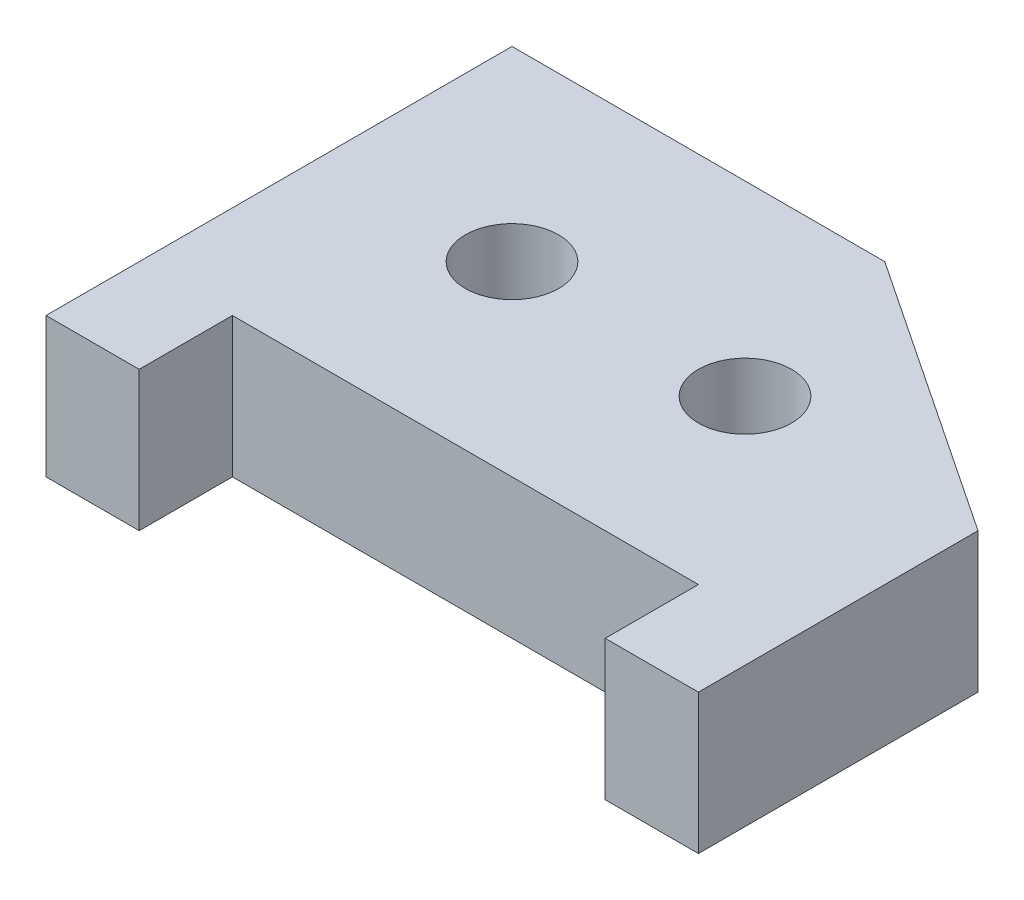
ISO-10303-21;
HEADER;
FILE_DESCRIPTION(('STEP AP214'),'2;1');
FILE_NAME('part.step','',(''),(''),'','','');
FILE_SCHEMA(('AUTOMOTIVE_DESIGN { 1 0 10303 214 1 1 1 1 }'));
ENDSEC;
DATA;
#1=APPLICATION_CONTEXT('core data for automotive mechanical design processes');
#2=APPLICATION_PROTOCOL_DEFINITION('international standard','automotive_design',2000,#1);
#3=PRODUCT_CONTEXT('',#1,'mechanical');
#4=PRODUCT('Part','Part','',(#3));
#5=PRODUCT_RELATED_PRODUCT_CATEGORY('part','',(#4));
#6=PRODUCT_DEFINITION_FORMATION('','',#4);
#7=PRODUCT_DEFINITION_CONTEXT('part definition',#1,'design');
#8=PRODUCT_DEFINITION('design','',#6,#7);
#9=PRODUCT_DEFINITION_SHAPE('','',#8);
#10=(LENGTH_UNIT() NAMED_UNIT(*) SI_UNIT(.MILLI.,.METRE.));
#11=(NAMED_UNIT(*) PLANE_ANGLE_UNIT() SI_UNIT($,.RADIAN.));
#12=(NAMED_UNIT(*) SI_UNIT($,.STERADIAN.) SOLID_ANGLE_UNIT());
#13=UNCERTAINTY_MEASURE_WITH_UNIT(LENGTH_MEASURE(1.E-05),#10,'distance_accuracy_value','');
#14=(GEOMETRIC_REPRESENTATION_CONTEXT(3) GLOBAL_UNCERTAINTY_ASSIGNED_CONTEXT((#13)) GLOBAL_UNIT_ASSIGNED_CONTEXT((#10,
#11,#12)) REPRESENTATION_CONTEXT('',''));
#15=CARTESIAN_POINT('',(0.,0.,0.));
#16=DIRECTION('',(0.,0.,1.));
#17=DIRECTION('',(1.,0.,0.));
#18=AXIS2_PLACEMENT_3D('',#15,#16,#17);
#19=CARTESIAN_POINT('',(0.,19.05,0.));
#20=DIRECTION('',(0.,1.,0.));
#21=DIRECTION('',(0.,0.,1.));
#22=AXIS2_PLACEMENT_3D('',#19,#20,#21);
#23=PLANE('',#22);
#24=CARTESIAN_POINT('',(-63.5,19.05,-38.1));
#25=DIRECTION('',(0.,1.,0.));
#26=DIRECTION('',(0.,0.,1.));
#27=AXIS2_PLACEMENT_3D('',#24,#25,#26);
#28=CIRCLE('',#27,6.35);
#29=CARTESIAN_POINT('',(-63.5,19.05,-44.45));
#30=VERTEX_POINT('',#29);
#31=EDGE_CURVE('E152',#30,#30,#28,.T.);
#32=ORIENTED_EDGE('',*,*,#31,.F.);
#33=EDGE_LOOP('',(#32));
#34=FACE_BOUND('',#33,.T.);
#35=DIRECTION('',(0.,0.,1.));
#36=VECTOR('',#35,1.);
#37=CARTESIAN_POINT('',(-88.9,19.05,-63.5));
#38=LINE('',#37,#36);
#39=CARTESIAN_POINT('',(-88.9,19.05,-63.5));
#40=VERTEX_POINT('',#39);
#41=CARTESIAN_POINT('',(-88.9,19.05,0.));
#42=VERTEX_POINT('',#41);
#43=EDGE_CURVE('E173',#40,#42,#38,.T.);
#44=ORIENTED_EDGE('',*,*,#43,.T.);
#45=DIRECTION('',(1.,0.,0.));
#46=VECTOR('',#45,1.);
#47=CARTESIAN_POINT('',(-88.9,19.05,0.));
#48=LINE('',#47,#46);
#49=CARTESIAN_POINT('',(-76.2,19.05,0.));
#50=VERTEX_POINT('',#49);
#51=EDGE_CURVE('E103',#42,#50,#48,.T.);
#52=ORIENTED_EDGE('',*,*,#51,.T.);
#53=DIRECTION('',(0.,0.,-1.));
#54=VECTOR('',#53,1.);
#55=CARTESIAN_POINT('',(-76.2,19.05,0.));
#56=LINE('',#55,#54);
#57=CARTESIAN_POINT('',(-76.2,19.05,-12.7));
#58=VERTEX_POINT('',#57);
#59=EDGE_CURVE('E198',#50,#58,#56,.T.);
#60=ORIENTED_EDGE('',*,*,#59,.T.);
#61=DIRECTION('',(1.,0.,0.));
#62=VECTOR('',#61,1.);
#63=CARTESIAN_POINT('',(-76.2,19.05,-12.7));
#64=LINE('',#63,#62);
#65=CARTESIAN_POINT('',(-12.7,19.05,-12.7));
#66=VERTEX_POINT('',#65);
#67=EDGE_CURVE('E216',#58,#66,#64,.T.);
#68=ORIENTED_EDGE('',*,*,#67,.T.);
#69=DIRECTION('',(0.,0.,1.));
#70=VECTOR('',#69,1.);
#71=CARTESIAN_POINT('',(-12.7,19.05,-12.7));
#72=LINE('',#71,#70);
#73=CARTESIAN_POINT('',(-12.7,19.05,0.));
#74=VERTEX_POINT('',#73);
#75=EDGE_CURVE('E214',#66,#74,#72,.T.);
#76=ORIENTED_EDGE('',*,*,#75,.T.);
#77=DIRECTION('',(1.,0.,0.));
#78=VECTOR('',#77,1.);
#79=CARTESIAN_POINT('',(-12.7,19.05,0.));
#80=LINE('',#79,#78);
#81=CARTESIAN_POINT('',(0.,19.05,0.));
#82=VERTEX_POINT('',#81);
#83=EDGE_CURVE('E125',#74,#82,#80,.T.);
#84=ORIENTED_EDGE('',*,*,#83,.T.);
#85=DIRECTION('',(0.,0.,-1.));
#86=VECTOR('',#85,1.);
#87=CARTESIAN_POINT('',(0.,19.05,0.));
#88=LINE('',#87,#86);
#89=CARTESIAN_POINT('',(0.,19.05,-38.1));
#90=VERTEX_POINT('',#89);
#91=EDGE_CURVE('E119',#82,#90,#88,.T.);
#92=ORIENTED_EDGE('',*,*,#91,.T.);
#93=DIRECTION('',(-0.832050294337843,0.,-0.554700196225229));
#94=VECTOR('',#93,1.);
#95=CARTESIAN_POINT('',(0.,19.05,-38.1));
#96=LINE('',#95,#94);
#97=CARTESIAN_POINT('',(-38.1,19.05,-63.5));
#98=VERTEX_POINT('',#97);
#99=EDGE_CURVE('E123',#90,#98,#96,.T.);
#100=ORIENTED_EDGE('',*,*,#99,.T.);
#101=DIRECTION('',(-1.,0.,0.));
#102=VECTOR('',#101,1.);
#103=CARTESIAN_POINT('',(-38.1,19.05,-63.5));
#104=LINE('',#103,#102);
#105=EDGE_CURVE('E57',#98,#40,#104,.T.);
#106=ORIENTED_EDGE('',*,*,#105,.T.);
#107=EDGE_LOOP('',(#44,#52,#60,#68,#76,#84,#92,#100,#106));
#108=FACE_BOUND('',#107,.T.);
#109=CARTESIAN_POINT('',(-31.75,19.05,-38.1000000000002));
#110=DIRECTION('',(0.,1.,0.));
#111=DIRECTION('',(0.,0.,1.));
#112=AXIS2_PLACEMENT_3D('',#109,#110,#111);
#113=CIRCLE('',#112,6.35);
#114=CARTESIAN_POINT('',(-31.75,19.05,-44.4500000000002));
#115=VERTEX_POINT('',#114);
#116=EDGE_CURVE('E232',#115,#115,#113,.T.);
#117=ORIENTED_EDGE('',*,*,#116,.F.);
#118=EDGE_LOOP('',(#117));
#119=FACE_BOUND('',#118,.T.);
#120=ADVANCED_FACE('F39',(#34,#108,#119),#23,.T.);
#121=CARTESIAN_POINT('',(0.,0.,0.));
#122=DIRECTION('',(0.,1.,0.));
#123=DIRECTION('',(0.,0.,1.));
#124=AXIS2_PLACEMENT_3D('',#121,#122,#123);
#125=PLANE('',#124);
#126=DIRECTION('',(0.,0.,1.));
#127=VECTOR('',#126,1.);
#128=CARTESIAN_POINT('',(-88.9,0.,-63.5));
#129=LINE('',#128,#127);
#130=CARTESIAN_POINT('',(-88.9,0.,-63.5));
#131=VERTEX_POINT('',#130);
#132=CARTESIAN_POINT('',(-88.9,0.,0.));
#133=VERTEX_POINT('',#132);
#134=EDGE_CURVE('E147',#131,#133,#129,.T.);
#135=ORIENTED_EDGE('',*,*,#134,.F.);
#136=DIRECTION('',(-1.,0.,0.));
#137=VECTOR('',#136,1.);
#138=CARTESIAN_POINT('',(-38.1,0.,-63.5));
#139=LINE('',#138,#137);
#140=CARTESIAN_POINT('',(-38.1,0.,-63.5));
#141=VERTEX_POINT('',#140);
#142=EDGE_CURVE('E95',#141,#131,#139,.T.);
#143=ORIENTED_EDGE('',*,*,#142,.F.);
#144=DIRECTION('',(-0.832050294337843,0.,-0.554700196225229));
#145=VECTOR('',#144,1.);
#146=CARTESIAN_POINT('',(0.,0.,-38.1));
#147=LINE('',#146,#145);
#148=CARTESIAN_POINT('',(0.,0.,-38.1));
#149=VERTEX_POINT('',#148);
#150=EDGE_CURVE('E89',#149,#141,#147,.T.);
#151=ORIENTED_EDGE('',*,*,#150,.F.);
#152=DIRECTION('',(0.,0.,-1.));
#153=VECTOR('',#152,1.);
#154=CARTESIAN_POINT('',(0.,0.,0.));
#155=LINE('',#154,#153);
#156=CARTESIAN_POINT('',(0.,0.,0.));
#157=VERTEX_POINT('',#156);
#158=EDGE_CURVE('E134',#157,#149,#155,.T.);
#159=ORIENTED_EDGE('',*,*,#158,.F.);
#160=DIRECTION('',(1.,0.,0.));
#161=VECTOR('',#160,1.);
#162=CARTESIAN_POINT('',(-12.7,0.,0.));
#163=LINE('',#162,#161);
#164=CARTESIAN_POINT('',(-12.7,0.,0.));
#165=VERTEX_POINT('',#164);
#166=EDGE_CURVE('E164',#165,#157,#163,.T.);
#167=ORIENTED_EDGE('',*,*,#166,.F.);
#168=DIRECTION('',(0.,0.,1.));
#169=VECTOR('',#168,1.);
#170=CARTESIAN_POINT('',(-12.7,0.,-12.7));
#171=LINE('',#170,#169);
#172=CARTESIAN_POINT('',(-12.7,0.,-12.7));
#173=VERTEX_POINT('',#172);
#174=EDGE_CURVE('E161',#173,#165,#171,.T.);
#175=ORIENTED_EDGE('',*,*,#174,.F.);
#176=DIRECTION('',(1.,0.,0.));
#177=VECTOR('',#176,1.);
#178=CARTESIAN_POINT('',(-76.2,0.,-12.7));
#179=LINE('',#178,#177);
#180=CARTESIAN_POINT('',(-76.2,0.,-12.7));
#181=VERTEX_POINT('',#180);
#182=EDGE_CURVE('E158',#181,#173,#179,.T.);
#183=ORIENTED_EDGE('',*,*,#182,.F.);
#184=DIRECTION('',(0.,0.,-1.));
#185=VECTOR('',#184,1.);
#186=CARTESIAN_POINT('',(-76.2,0.,0.));
#187=LINE('',#186,#185);
#188=CARTESIAN_POINT('',(-76.2,0.,0.));
#189=VERTEX_POINT('',#188);
#190=EDGE_CURVE('E155',#189,#181,#187,.T.);
#191=ORIENTED_EDGE('',*,*,#190,.F.);
#192=DIRECTION('',(1.,0.,0.));
#193=VECTOR('',#192,1.);
#194=CARTESIAN_POINT('',(-88.9,0.,0.));
#195=LINE('',#194,#193);
#196=EDGE_CURVE('E151',#133,#189,#195,.T.);
#197=ORIENTED_EDGE('',*,*,#196,.F.);
#198=EDGE_LOOP('',(#135,#143,#151,#159,#167,#175,#183,#191,#197));
#199=FACE_BOUND('',#198,.T.);
#200=CARTESIAN_POINT('',(-63.5,0.,-38.1));
#201=DIRECTION('',(0.,1.,0.));
#202=DIRECTION('',(0.,0.,1.));
#203=AXIS2_PLACEMENT_3D('',#200,#201,#202);
#204=CIRCLE('',#203,6.35);
#205=CARTESIAN_POINT('',(-63.5,0.,-44.45));
#206=VERTEX_POINT('',#205);
#207=EDGE_CURVE('E228',#206,#206,#204,.T.);
#208=ORIENTED_EDGE('',*,*,#207,.T.);
#209=EDGE_LOOP('',(#208));
#210=FACE_BOUND('',#209,.T.);
#211=CARTESIAN_POINT('',(-31.75,0.,-38.1000000000002));
#212=DIRECTION('',(0.,1.,0.));
#213=DIRECTION('',(0.,0.,1.));
#214=AXIS2_PLACEMENT_3D('',#211,#212,#213);
#215=CIRCLE('',#214,6.35);
#216=CARTESIAN_POINT('',(-31.75,0.,-44.4500000000002));
#217=VERTEX_POINT('',#216);
#218=EDGE_CURVE('E236',#217,#217,#215,.T.);
#219=ORIENTED_EDGE('',*,*,#218,.T.);
#220=EDGE_LOOP('',(#219));
#221=FACE_BOUND('',#220,.T.);
#222=ADVANCED_FACE('F202',(#199,#210,#221),#125,.F.);
#223=CARTESIAN_POINT('',(-88.9,19.05,-63.5));
#224=DIRECTION('',(1.,0.,0.));
#225=DIRECTION('',(0.,0.,-1.));
#226=AXIS2_PLACEMENT_3D('',#223,#224,#225);
#227=PLANE('',#226);
#228=ORIENTED_EDGE('',*,*,#134,.T.);
#229=DIRECTION('',(0.,-1.,0.));
#230=VECTOR('',#229,1.);
#231=CARTESIAN_POINT('',(-88.9,19.05,0.));
#232=LINE('',#231,#230);
#233=EDGE_CURVE('E11',#42,#133,#232,.T.);
#234=ORIENTED_EDGE('',*,*,#233,.F.);
#235=ORIENTED_EDGE('',*,*,#43,.F.);
#236=DIRECTION('',(0.,-1.,0.));
#237=VECTOR('',#236,1.);
#238=CARTESIAN_POINT('',(-88.9,19.05,-63.5));
#239=LINE('',#238,#237);
#240=EDGE_CURVE('E143',#40,#131,#239,.T.);
#241=ORIENTED_EDGE('',*,*,#240,.T.);
#242=EDGE_LOOP('',(#228,#234,#235,#241));
#243=FACE_BOUND('',#242,.T.);
#244=ADVANCED_FACE('F41',(#243),#227,.F.);
#245=CARTESIAN_POINT('',(-88.9,19.05,0.));
#246=DIRECTION('',(0.,0.,-1.));
#247=DIRECTION('',(-1.,0.,0.));
#248=AXIS2_PLACEMENT_3D('',#245,#246,#247);
#249=PLANE('',#248);
#250=ORIENTED_EDGE('',*,*,#196,.T.);
#251=DIRECTION('',(0.,-1.,0.));
#252=VECTOR('',#251,1.);
#253=CARTESIAN_POINT('',(-76.2,19.05,0.));
#254=LINE('',#253,#252);
#255=EDGE_CURVE('E49',#50,#189,#254,.T.);
#256=ORIENTED_EDGE('',*,*,#255,.F.);
#257=ORIENTED_EDGE('',*,*,#51,.F.);
#258=ORIENTED_EDGE('',*,*,#233,.T.);
#259=EDGE_LOOP('',(#250,#256,#257,#258));
#260=FACE_BOUND('',#259,.T.);
#261=ADVANCED_FACE('F274',(#260),#249,.F.);
#262=CARTESIAN_POINT('',(-76.2,19.05,0.));
#263=DIRECTION('',(-1.,0.,0.));
#264=DIRECTION('',(0.,0.,1.));
#265=AXIS2_PLACEMENT_3D('',#262,#263,#264);
#266=PLANE('',#265);
#267=ORIENTED_EDGE('',*,*,#190,.T.);
#268=DIRECTION('',(0.,-1.,0.));
#269=VECTOR('',#268,1.);
#270=CARTESIAN_POINT('',(-76.2,19.05,-12.7));
#271=LINE('',#270,#269);
#272=EDGE_CURVE('E188',#58,#181,#271,.T.);
#273=ORIENTED_EDGE('',*,*,#272,.F.);
#274=ORIENTED_EDGE('',*,*,#59,.F.);
#275=ORIENTED_EDGE('',*,*,#255,.T.);
#276=EDGE_LOOP('',(#267,#273,#274,#275));
#277=FACE_BOUND('',#276,.T.);
#278=ADVANCED_FACE('F196',(#277),#266,.F.);
#279=CARTESIAN_POINT('',(-76.2,19.05,-12.7));
#280=DIRECTION('',(0.,0.,-1.));
#281=DIRECTION('',(-1.,0.,0.));
#282=AXIS2_PLACEMENT_3D('',#279,#280,#281);
#283=PLANE('',#282);
#284=ORIENTED_EDGE('',*,*,#182,.T.);
#285=DIRECTION('',(0.,-1.,0.));
#286=VECTOR('',#285,1.);
#287=CARTESIAN_POINT('',(-12.7,19.05,-12.7));
#288=LINE('',#287,#286);
#289=EDGE_CURVE('E184',#66,#173,#288,.T.);
#290=ORIENTED_EDGE('',*,*,#289,.F.);
#291=ORIENTED_EDGE('',*,*,#67,.F.);
#292=ORIENTED_EDGE('',*,*,#272,.T.);
#293=EDGE_LOOP('',(#284,#290,#291,#292));
#294=FACE_BOUND('',#293,.T.);
#295=ADVANCED_FACE('F208',(#294),#283,.F.);
#296=CARTESIAN_POINT('',(-12.7,19.05,-12.7));
#297=DIRECTION('',(1.,0.,0.));
#298=DIRECTION('',(0.,0.,-1.));
#299=AXIS2_PLACEMENT_3D('',#296,#297,#298);
#300=PLANE('',#299);
#301=ORIENTED_EDGE('',*,*,#174,.T.);
#302=DIRECTION('',(0.,-1.,0.));
#303=VECTOR('',#302,1.);
#304=CARTESIAN_POINT('',(-12.7,19.05,0.));
#305=LINE('',#304,#303);
#306=EDGE_CURVE('E180',#74,#165,#305,.T.);
#307=ORIENTED_EDGE('',*,*,#306,.F.);
#308=ORIENTED_EDGE('',*,*,#75,.F.);
#309=ORIENTED_EDGE('',*,*,#289,.T.);
#310=EDGE_LOOP('',(#301,#307,#308,#309));
#311=FACE_BOUND('',#310,.T.);
#312=ADVANCED_FACE('F212',(#311),#300,.F.);
#313=CARTESIAN_POINT('',(-12.7,19.05,0.));
#314=DIRECTION('',(0.,0.,-1.));
#315=DIRECTION('',(-1.,0.,0.));
#316=AXIS2_PLACEMENT_3D('',#313,#314,#315);
#317=PLANE('',#316);
#318=ORIENTED_EDGE('',*,*,#166,.T.);
#319=DIRECTION('',(0.,-1.,0.));
#320=VECTOR('',#319,1.);
#321=CARTESIAN_POINT('',(0.,19.05,0.));
#322=LINE('',#321,#320);
#323=EDGE_CURVE('E136',#82,#157,#322,.T.);
#324=ORIENTED_EDGE('',*,*,#323,.F.);
#325=ORIENTED_EDGE('',*,*,#83,.F.);
#326=ORIENTED_EDGE('',*,*,#306,.T.);
#327=EDGE_LOOP('',(#318,#324,#325,#326));
#328=FACE_BOUND('',#327,.T.);
#329=ADVANCED_FACE('F265',(#328),#317,.F.);
#330=CARTESIAN_POINT('',(0.,19.05,0.));
#331=DIRECTION('',(-1.,0.,0.));
#332=DIRECTION('',(0.,0.,1.));
#333=AXIS2_PLACEMENT_3D('',#330,#331,#332);
#334=PLANE('',#333);
#335=ORIENTED_EDGE('',*,*,#158,.T.);
#336=DIRECTION('',(0.,-1.,0.));
#337=VECTOR('',#336,1.);
#338=CARTESIAN_POINT('',(0.,19.05,-38.1));
#339=LINE('',#338,#337);
#340=EDGE_CURVE('E131',#90,#149,#339,.T.);
#341=ORIENTED_EDGE('',*,*,#340,.F.);
#342=ORIENTED_EDGE('',*,*,#91,.F.);
#343=ORIENTED_EDGE('',*,*,#323,.T.);
#344=EDGE_LOOP('',(#335,#341,#342,#343));
#345=FACE_BOUND('',#344,.T.);
#346=ADVANCED_FACE('F132',(#345),#334,.F.);
#347=CARTESIAN_POINT('',(0.,19.05,-38.1));
#348=DIRECTION('',(-0.554700196225229,0.,0.832050294337844));
#349=DIRECTION('',(0.832050294337844,0.,0.554700196225229));
#350=AXIS2_PLACEMENT_3D('',#347,#348,#349);
#351=PLANE('',#350);
#352=ORIENTED_EDGE('',*,*,#150,.T.);
#353=DIRECTION('',(0.,-1.,0.));
#354=VECTOR('',#353,1.);
#355=CARTESIAN_POINT('',(-38.1,19.05,-63.5));
#356=LINE('',#355,#354);
#357=EDGE_CURVE('E137',#98,#141,#356,.T.);
#358=ORIENTED_EDGE('',*,*,#357,.F.);
#359=ORIENTED_EDGE('',*,*,#99,.F.);
#360=ORIENTED_EDGE('',*,*,#340,.T.);
#361=EDGE_LOOP('',(#352,#358,#359,#360));
#362=FACE_BOUND('',#361,.T.);
#363=ADVANCED_FACE('F139',(#362),#351,.F.);
#364=CARTESIAN_POINT('',(-38.1,19.05,-63.5));
#365=DIRECTION('',(0.,0.,1.));
#366=DIRECTION('',(1.,0.,0.));
#367=AXIS2_PLACEMENT_3D('',#364,#365,#366);
#368=PLANE('',#367);
#369=ORIENTED_EDGE('',*,*,#142,.T.);
#370=ORIENTED_EDGE('',*,*,#240,.F.);
#371=ORIENTED_EDGE('',*,*,#105,.F.);
#372=ORIENTED_EDGE('',*,*,#357,.T.);
#373=EDGE_LOOP('',(#369,#370,#371,#372));
#374=FACE_BOUND('',#373,.T.);
#375=ADVANCED_FACE('F258',(#374),#368,.F.);
#376=CARTESIAN_POINT('',(-63.5,19.05,-38.1));
#377=DIRECTION('',(0.,-1.,0.));
#378=DIRECTION('',(0.,0.,-1.));
#379=AXIS2_PLACEMENT_3D('',#376,#377,#378);
#380=CYLINDRICAL_SURFACE('',#379,6.35);
#381=CARTESIAN_POINT('',(-63.5,19.05,-44.45));
#382=CARTESIAN_POINT('',(-63.5,18.8515625,-44.45));
#383=CARTESIAN_POINT('',(-63.5,18.653125,-44.45));
#384=CARTESIAN_POINT('',(-63.5,18.25625,-44.45));
#385=CARTESIAN_POINT('',(-63.5,18.0578125,-44.45));
#386=CARTESIAN_POINT('',(-63.5,17.6609375,-44.45));
#387=CARTESIAN_POINT('',(-63.5,17.4625,-44.45));
#388=CARTESIAN_POINT('',(-63.5,17.065625,-44.45));
#389=CARTESIAN_POINT('',(-63.5,16.8671875,-44.45));
#390=CARTESIAN_POINT('',(-63.5,16.4703125,-44.45));
#391=CARTESIAN_POINT('',(-63.5,16.271875,-44.45));
#392=CARTESIAN_POINT('',(-63.5,15.875,-44.45));
#393=CARTESIAN_POINT('',(-63.5,15.6765625,-44.45));
#394=CARTESIAN_POINT('',(-63.5,15.2796875,-44.45));
#395=CARTESIAN_POINT('',(-63.5,15.08125,-44.45));
#396=CARTESIAN_POINT('',(-63.5,14.684375,-44.45));
#397=CARTESIAN_POINT('',(-63.5,14.4859375,-44.45));
#398=CARTESIAN_POINT('',(-63.5,14.0890625,-44.45));
#399=CARTESIAN_POINT('',(-63.5,13.890625,-44.45));
#400=CARTESIAN_POINT('',(-63.5,13.49375,-44.45));
#401=CARTESIAN_POINT('',(-63.5,13.2953125,-44.45));
#402=CARTESIAN_POINT('',(-63.5,12.8984375,-44.45));
#403=CARTESIAN_POINT('',(-63.5,12.7,-44.45));
#404=CARTESIAN_POINT('',(-63.5,12.303125,-44.45));
#405=CARTESIAN_POINT('',(-63.5,12.1046875,-44.45));
#406=CARTESIAN_POINT('',(-63.5,11.7078125,-44.45));
#407=CARTESIAN_POINT('',(-63.5,11.509375,-44.45));
#408=CARTESIAN_POINT('',(-63.5,11.1125,-44.45));
#409=CARTESIAN_POINT('',(-63.5,10.9140625,-44.45));
#410=CARTESIAN_POINT('',(-63.5,10.5171875,-44.45));
#411=CARTESIAN_POINT('',(-63.5,10.31875,-44.45));
#412=CARTESIAN_POINT('',(-63.5,9.921875,-44.45));
#413=CARTESIAN_POINT('',(-63.5,9.7234375,-44.45));
#414=CARTESIAN_POINT('',(-63.5,9.3265625,-44.45));
#415=CARTESIAN_POINT('',(-63.5,9.128125,-44.45));
#416=CARTESIAN_POINT('',(-63.5,8.73125,-44.45));
#417=CARTESIAN_POINT('',(-63.5,8.5328125,-44.45));
#418=CARTESIAN_POINT('',(-63.5,8.1359375,-44.45));
#419=CARTESIAN_POINT('',(-63.5,7.9375,-44.45));
#420=CARTESIAN_POINT('',(-63.5,7.540625,-44.45));
#421=CARTESIAN_POINT('',(-63.5,7.3421875,-44.45));
#422=CARTESIAN_POINT('',(-63.5,6.9453125,-44.45));
#423=CARTESIAN_POINT('',(-63.5,6.746875,-44.45));
#424=CARTESIAN_POINT('',(-63.5,6.35,-44.45));
#425=CARTESIAN_POINT('',(-63.5,6.1515625,-44.45));
#426=CARTESIAN_POINT('',(-63.5,5.7546875,-44.45));
#427=CARTESIAN_POINT('',(-63.5,5.55625,-44.45));
#428=CARTESIAN_POINT('',(-63.5,5.159375,-44.45));
#429=CARTESIAN_POINT('',(-63.5,4.9609375,-44.45));
#430=CARTESIAN_POINT('',(-63.5,4.5640625,-44.45));
#431=CARTESIAN_POINT('',(-63.5,4.365625,-44.45));
#432=CARTESIAN_POINT('',(-63.5,3.96875,-44.45));
#433=CARTESIAN_POINT('',(-63.5,3.7703125,-44.45));
#434=CARTESIAN_POINT('',(-63.5,3.3734375,-44.45));
#435=CARTESIAN_POINT('',(-63.5,3.175,-44.45));
#436=CARTESIAN_POINT('',(-63.5,2.778125,-44.45));
#437=CARTESIAN_POINT('',(-63.5,2.5796875,-44.45));
#438=CARTESIAN_POINT('',(-63.5,2.1828125,-44.45));
#439=CARTESIAN_POINT('',(-63.5,1.984375,-44.45));
#440=CARTESIAN_POINT('',(-63.5,1.5875,-44.45));
#441=CARTESIAN_POINT('',(-63.5,1.3890625,-44.45));
#442=CARTESIAN_POINT('',(-63.5,0.992187500000001,-44.45));
#443=CARTESIAN_POINT('',(-63.5,0.793750000000001,-44.45));
#444=CARTESIAN_POINT('',(-63.5,0.396875,-44.45));
#445=CARTESIAN_POINT('',(-63.5,0.1984375,-44.45));
#446=CARTESIAN_POINT('',(-63.5,0.,-44.45));
#447=B_SPLINE_CURVE_WITH_KNOTS('',3,(#381,#382,#383,#384,#385,#386,#387,#388,#389,#390,#391,
#392,#393,#394,#395,#396,#397,#398,#399,#400,#401,#402,#403,#404,#405,#406,#407,#408,#409,#410,
#411,#412,#413,#414,#415,#416,#417,#418,#419,#420,#421,#422,#423,#424,#425,#426,#427,#428,#429,
#430,#431,#432,#433,#434,#435,#436,#437,#438,#439,#440,#441,#442,#443,#444,#445,#446),
.UNSPECIFIED.,.F.,.F.,(4,2,2,2,2,2,2,2,2,2,2,2,2,2,2,2,2,2,2,2,2,2,2,2,2,2,2,2,2,2,2,2,4),(0.,
0.5953125,1.190625,1.7859375,2.38125,2.9765625,3.571875,4.1671875,4.7625,5.3578125,5.953125,
6.5484375,7.14375,7.7390625,8.334375,8.9296875,9.525,10.1203125,10.715625,11.3109375,11.90625,
12.5015625,13.096875,13.6921875,14.2875,14.8828125,15.478125,16.0734375,16.66875,17.2640625,
17.859375,18.4546875,19.05),.UNSPECIFIED.);
#448=EDGE_CURVE('BSEAM255',#30,#206,#447,.T.);
#449=ORIENTED_EDGE('',*,*,#31,.T.);
#450=ORIENTED_EDGE('',*,*,#207,.F.);
#451=ORIENTED_EDGE('',*,*,#448,.T.);
#452=ORIENTED_EDGE('',*,*,#448,.F.);
#453=EDGE_LOOP('',(#449,#451,#450,#452));
#454=FACE_BOUND('',#453,.T.);
#455=ADVANCED_FACE('F255',(#454),#380,.F.);
#456=CARTESIAN_POINT('',(-31.75,19.05,-38.1000000000002));
#457=DIRECTION('',(0.,-1.,0.));
#458=DIRECTION('',(0.,0.,-1.));
#459=AXIS2_PLACEMENT_3D('',#456,#457,#458);
#460=CYLINDRICAL_SURFACE('',#459,6.35);
#461=CARTESIAN_POINT('',(-31.75,19.05,-44.4500000000002));
#462=CARTESIAN_POINT('',(-31.75,18.8515625,-44.4500000000002));
#463=CARTESIAN_POINT('',(-31.75,18.653125,-44.4500000000002));
#464=CARTESIAN_POINT('',(-31.75,18.25625,-44.4500000000002));
#465=CARTESIAN_POINT('',(-31.75,18.0578125,-44.4500000000002));
#466=CARTESIAN_POINT('',(-31.75,17.6609375,-44.4500000000002));
#467=CARTESIAN_POINT('',(-31.75,17.4625,-44.4500000000002));
#468=CARTESIAN_POINT('',(-31.75,17.065625,-44.4500000000002));
#469=CARTESIAN_POINT('',(-31.75,16.8671875,-44.4500000000002));
#470=CARTESIAN_POINT('',(-31.75,16.4703125,-44.4500000000002));
#471=CARTESIAN_POINT('',(-31.75,16.271875,-44.4500000000002));
#472=CARTESIAN_POINT('',(-31.75,15.875,-44.4500000000002));
#473=CARTESIAN_POINT('',(-31.75,15.6765625,-44.4500000000002));
#474=CARTESIAN_POINT('',(-31.75,15.2796875,-44.4500000000002));
#475=CARTESIAN_POINT('',(-31.75,15.08125,-44.4500000000002));
#476=CARTESIAN_POINT('',(-31.75,14.684375,-44.4500000000002));
#477=CARTESIAN_POINT('',(-31.75,14.4859375,-44.4500000000002));
#478=CARTESIAN_POINT('',(-31.75,14.0890625,-44.4500000000002));
#479=CARTESIAN_POINT('',(-31.75,13.890625,-44.4500000000002));
#480=CARTESIAN_POINT('',(-31.75,13.49375,-44.4500000000002));
#481=CARTESIAN_POINT('',(-31.75,13.2953125,-44.4500000000002));
#482=CARTESIAN_POINT('',(-31.75,12.8984375,-44.4500000000002));
#483=CARTESIAN_POINT('',(-31.75,12.7,-44.4500000000002));
#484=CARTESIAN_POINT('',(-31.75,12.303125,-44.4500000000002));
#485=CARTESIAN_POINT('',(-31.75,12.1046875,-44.4500000000002));
#486=CARTESIAN_POINT('',(-31.75,11.7078125,-44.4500000000002));
#487=CARTESIAN_POINT('',(-31.75,11.509375,-44.4500000000002));
#488=CARTESIAN_POINT('',(-31.75,11.1125,-44.4500000000002));
#489=CARTESIAN_POINT('',(-31.75,10.9140625,-44.4500000000002));
#490=CARTESIAN_POINT('',(-31.75,10.5171875,-44.4500000000002));
#491=CARTESIAN_POINT('',(-31.75,10.31875,-44.4500000000002));
#492=CARTESIAN_POINT('',(-31.75,9.921875,-44.4500000000002));
#493=CARTESIAN_POINT('',(-31.75,9.7234375,-44.4500000000002));
#494=CARTESIAN_POINT('',(-31.75,9.3265625,-44.4500000000002));
#495=CARTESIAN_POINT('',(-31.75,9.128125,-44.4500000000002));
#496=CARTESIAN_POINT('',(-31.75,8.73125,-44.4500000000002));
#497=CARTESIAN_POINT('',(-31.75,8.5328125,-44.4500000000002));
#498=CARTESIAN_POINT('',(-31.75,8.1359375,-44.4500000000002));
#499=CARTESIAN_POINT('',(-31.75,7.9375,-44.4500000000002));
#500=CARTESIAN_POINT('',(-31.75,7.540625,-44.4500000000002));
#501=CARTESIAN_POINT('',(-31.75,7.3421875,-44.4500000000002));
#502=CARTESIAN_POINT('',(-31.75,6.9453125,-44.4500000000002));
#503=CARTESIAN_POINT('',(-31.75,6.746875,-44.4500000000002));
#504=CARTESIAN_POINT('',(-31.75,6.35,-44.4500000000002));
#505=CARTESIAN_POINT('',(-31.75,6.1515625,-44.4500000000002));
#506=CARTESIAN_POINT('',(-31.75,5.7546875,-44.4500000000002));
#507=CARTESIAN_POINT('',(-31.75,5.55625,-44.4500000000002));
#508=CARTESIAN_POINT('',(-31.75,5.159375,-44.4500000000002));
#509=CARTESIAN_POINT('',(-31.75,4.9609375,-44.4500000000002));
#510=CARTESIAN_POINT('',(-31.75,4.5640625,-44.4500000000002));
#511=CARTESIAN_POINT('',(-31.75,4.365625,-44.4500000000002));
#512=CARTESIAN_POINT('',(-31.75,3.96875,-44.4500000000002));
#513=CARTESIAN_POINT('',(-31.75,3.7703125,-44.4500000000002));
#514=CARTESIAN_POINT('',(-31.75,3.3734375,-44.4500000000002));
#515=CARTESIAN_POINT('',(-31.75,3.175,-44.4500000000002));
#516=CARTESIAN_POINT('',(-31.75,2.778125,-44.4500000000002));
#517=CARTESIAN_POINT('',(-31.75,2.5796875,-44.4500000000002));
#518=CARTESIAN_POINT('',(-31.75,2.1828125,-44.4500000000002));
#519=CARTESIAN_POINT('',(-31.75,1.984375,-44.4500000000002));
#520=CARTESIAN_POINT('',(-31.75,1.5875,-44.4500000000002));
#521=CARTESIAN_POINT('',(-31.75,1.3890625,-44.4500000000002));
#522=CARTESIAN_POINT('',(-31.75,0.992187500000001,-44.4500000000002));
#523=CARTESIAN_POINT('',(-31.75,0.793750000000001,-44.4500000000002));
#524=CARTESIAN_POINT('',(-31.75,0.396875,-44.4500000000002));
#525=CARTESIAN_POINT('',(-31.75,0.1984375,-44.4500000000002));
#526=CARTESIAN_POINT('',(-31.75,0.,-44.4500000000002));
#527=B_SPLINE_CURVE_WITH_KNOTS('',3,(#461,#462,#463,#464,#465,#466,#467,#468,#469,#470,#471,
#472,#473,#474,#475,#476,#477,#478,#479,#480,#481,#482,#483,#484,#485,#486,#487,#488,#489,#490,
#491,#492,#493,#494,#495,#496,#497,#498,#499,#500,#501,#502,#503,#504,#505,#506,#507,#508,#509,
#510,#511,#512,#513,#514,#515,#516,#517,#518,#519,#520,#521,#522,#523,#524,#525,#526),
.UNSPECIFIED.,.F.,.F.,(4,2,2,2,2,2,2,2,2,2,2,2,2,2,2,2,2,2,2,2,2,2,2,2,2,2,2,2,2,2,2,2,4),(0.,
0.5953125,1.190625,1.7859375,2.38125,2.9765625,3.571875,4.1671875,4.7625,5.3578125,5.953125,
6.5484375,7.14375,7.7390625,8.334375,8.9296875,9.525,10.1203125,10.715625,11.3109375,11.90625,
12.5015625,13.096875,13.6921875,14.2875,14.8828125,15.478125,16.0734375,16.66875,17.2640625,
17.859375,18.4546875,19.05),.UNSPECIFIED.);
#528=EDGE_CURVE('BSEAM244',#115,#217,#527,.T.);
#529=ORIENTED_EDGE('',*,*,#116,.T.);
#530=ORIENTED_EDGE('',*,*,#218,.F.);
#531=ORIENTED_EDGE('',*,*,#528,.T.);
#532=ORIENTED_EDGE('',*,*,#528,.F.);
#533=EDGE_LOOP('',(#529,#531,#530,#532));
#534=FACE_BOUND('',#533,.T.);
#535=ADVANCED_FACE('F244',(#534),#460,.F.);
#536=CLOSED_SHELL('',(#120,#222,#244,#261,#278,#295,#312,#329,#346,#363,#375,#455,#535));
#537=MANIFOLD_SOLID_BREP('B2',#536);
#538=ADVANCED_BREP_SHAPE_REPRESENTATION('',(#18,#537),#14);
#539=SHAPE_DEFINITION_REPRESENTATION(#9,#538);
ENDSEC;
END-ISO-10303-21;
